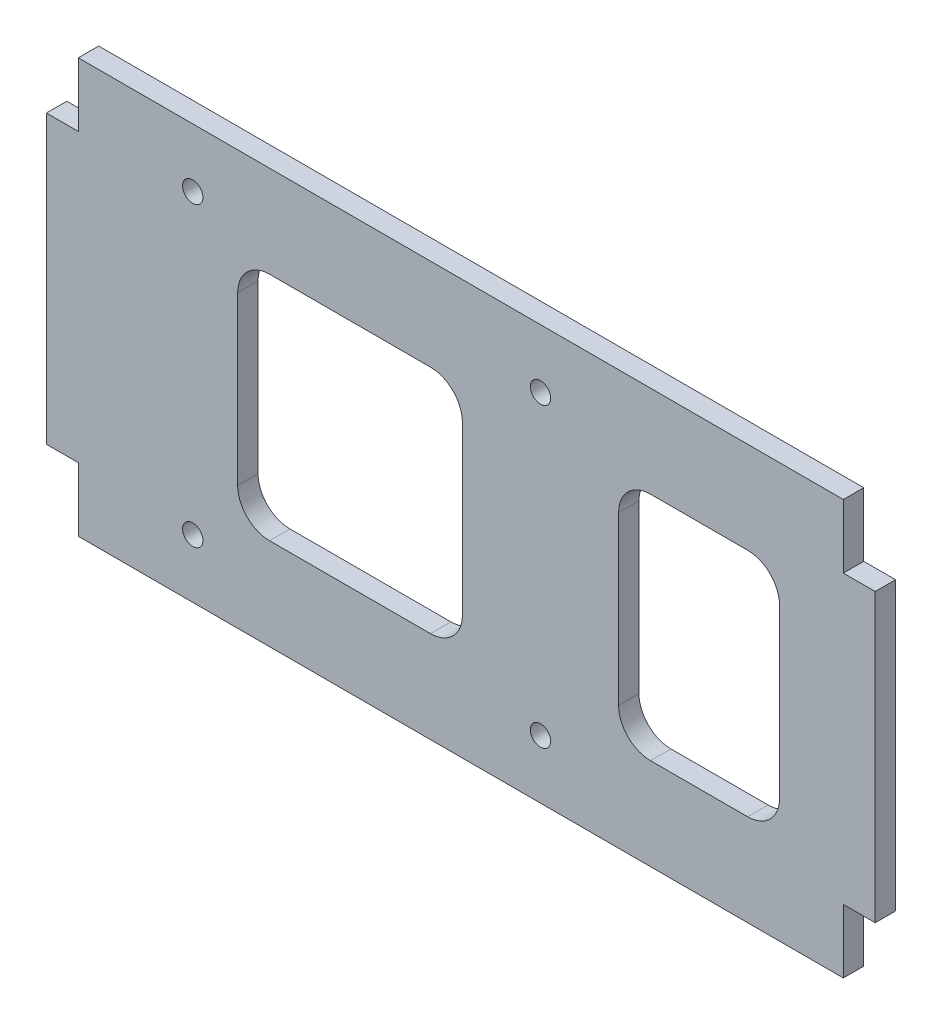
ISO-10303-21;
HEADER;
FILE_DESCRIPTION(('STEP AP214'),'2;1');
FILE_NAME('part.step','',(''),(''),'','','');
FILE_SCHEMA(('AUTOMOTIVE_DESIGN { 1 0 10303 214 1 1 1 1 }'));
ENDSEC;
DATA;
#1=APPLICATION_CONTEXT('core data for automotive mechanical design processes');
#2=APPLICATION_PROTOCOL_DEFINITION('international standard','automotive_design',2000,#1);
#3=PRODUCT_CONTEXT('',#1,'mechanical');
#4=PRODUCT('Part','Part','',(#3));
#5=PRODUCT_RELATED_PRODUCT_CATEGORY('part','',(#4));
#6=PRODUCT_DEFINITION_FORMATION('','',#4);
#7=PRODUCT_DEFINITION_CONTEXT('part definition',#1,'design');
#8=PRODUCT_DEFINITION('design','',#6,#7);
#9=PRODUCT_DEFINITION_SHAPE('','',#8);
#10=(LENGTH_UNIT() NAMED_UNIT(*) SI_UNIT(.MILLI.,.METRE.));
#11=(NAMED_UNIT(*) PLANE_ANGLE_UNIT() SI_UNIT($,.RADIAN.));
#12=(NAMED_UNIT(*) SI_UNIT($,.STERADIAN.) SOLID_ANGLE_UNIT());
#13=UNCERTAINTY_MEASURE_WITH_UNIT(LENGTH_MEASURE(1.E-05),#10,'distance_accuracy_value','');
#14=(GEOMETRIC_REPRESENTATION_CONTEXT(3) GLOBAL_UNCERTAINTY_ASSIGNED_CONTEXT((#13)) GLOBAL_UNIT_ASSIGNED_CONTEXT((#10,
#11,#12)) REPRESENTATION_CONTEXT('',''));
#15=CARTESIAN_POINT('',(0.,0.,0.));
#16=DIRECTION('',(0.,0.,1.));
#17=DIRECTION('',(1.,0.,0.));
#18=AXIS2_PLACEMENT_3D('',#15,#16,#17);
#19=CARTESIAN_POINT('',(0.,0.,4.064));
#20=DIRECTION('',(0.,0.,-1.));
#21=DIRECTION('',(-1.,0.,0.));
#22=AXIS2_PLACEMENT_3D('',#19,#20,#21);
#23=PLANE('',#22);
#24=CARTESIAN_POINT('',(-53.7097973205949,-29.5910000000044,4.064));
#25=DIRECTION('',(0.,0.,1.));
#26=DIRECTION('',(1.,0.,0.));
#27=AXIS2_PLACEMENT_3D('',#24,#25,#26);
#28=CIRCLE('',#27,2.03199999999981);
#29=CARTESIAN_POINT('',(-51.6777973205951,-29.5910000000044,4.064));
#30=VERTEX_POINT('',#29);
#31=EDGE_CURVE('E812',#30,#30,#28,.T.);
#32=ORIENTED_EDGE('',*,*,#31,.F.);
#33=EDGE_LOOP('',(#32));
#34=FACE_BOUND('',#33,.T.);
#35=CARTESIAN_POINT('',(-53.7097973205949,29.5910000000039,4.064));
#36=DIRECTION('',(0.,0.,1.));
#37=DIRECTION('',(1.,0.,0.));
#38=AXIS2_PLACEMENT_3D('',#35,#36,#37);
#39=CIRCLE('',#38,2.03199999999981);
#40=CARTESIAN_POINT('',(-51.6777973205951,29.5910000000039,4.064));
#41=VERTEX_POINT('',#40);
#42=EDGE_CURVE('E258',#41,#41,#39,.T.);
#43=ORIENTED_EDGE('',*,*,#42,.F.);
#44=EDGE_LOOP('',(#43));
#45=FACE_BOUND('',#44,.T.);
#46=CARTESIAN_POINT('',(56.8325000000005,16.6370000000051,4.064));
#47=DIRECTION('',(0.,0.,1.));
#48=DIRECTION('',(1.,0.,0.));
#49=AXIS2_PLACEMENT_3D('',#46,#47,#48);
#50=CIRCLE('',#49,6.34999999999963);
#51=CARTESIAN_POINT('',(63.1825000000004,16.6370000000033,4.064));
#52=VERTEX_POINT('',#51);
#53=CARTESIAN_POINT('',(56.8325000000005,22.9870000000045,4.064));
#54=VERTEX_POINT('',#53);
#55=EDGE_CURVE('E288',#52,#54,#50,.T.);
#56=ORIENTED_EDGE('',*,*,#55,.F.);
#57=DIRECTION('',(0.,1.,0.));
#58=VECTOR('',#57,1.);
#59=CARTESIAN_POINT('',(63.1825000000004,16.6370000000033,4.064));
#60=LINE('',#59,#58);
#61=CARTESIAN_POINT('',(63.1825000000004,-16.6370000000056,4.064));
#62=VERTEX_POINT('',#61);
#63=EDGE_CURVE('E304',#62,#52,#60,.T.);
#64=ORIENTED_EDGE('',*,*,#63,.F.);
#65=CARTESIAN_POINT('',(56.8325000000005,-16.6370000000051,4.064));
#66=DIRECTION('',(0.,0.,1.));
#67=DIRECTION('',(1.,0.,0.));
#68=AXIS2_PLACEMENT_3D('',#65,#66,#67);
#69=CIRCLE('',#68,6.34999999999963);
#70=CARTESIAN_POINT('',(56.8325000000005,-22.9870000000045,4.064));
#71=VERTEX_POINT('',#70);
#72=EDGE_CURVE('E301',#71,#62,#69,.T.);
#73=ORIENTED_EDGE('',*,*,#72,.F.);
#74=DIRECTION('',(1.,0.,0.));
#75=VECTOR('',#74,1.);
#76=CARTESIAN_POINT('',(56.8325000000005,-22.9870000000045,4.064));
#77=LINE('',#76,#75);
#78=CARTESIAN_POINT('',(37.4649999999992,-22.987000000005,4.064));
#79=VERTEX_POINT('',#78);
#80=EDGE_CURVE('E299',#79,#71,#77,.T.);
#81=ORIENTED_EDGE('',*,*,#80,.F.);
#82=CARTESIAN_POINT('',(37.4649999999992,-16.6370000000042,4.064));
#83=DIRECTION('',(0.,0.,1.));
#84=DIRECTION('',(1.,0.,0.));
#85=AXIS2_PLACEMENT_3D('',#82,#83,#84);
#86=CIRCLE('',#85,6.35000000000074);
#87=CARTESIAN_POINT('',(31.114999999998,-16.6370000000042,4.064));
#88=VERTEX_POINT('',#87);
#89=EDGE_CURVE('E297',#88,#79,#86,.T.);
#90=ORIENTED_EDGE('',*,*,#89,.F.);
#91=DIRECTION('',(0.,-1.,0.));
#92=VECTOR('',#91,1.);
#93=CARTESIAN_POINT('',(31.114999999998,16.6370000000042,4.064));
#94=LINE('',#93,#92);
#95=CARTESIAN_POINT('',(31.1149999999984,16.6370000000042,4.064));
#96=VERTEX_POINT('',#95);
#97=EDGE_CURVE('E295',#96,#88,#94,.T.);
#98=ORIENTED_EDGE('',*,*,#97,.F.);
#99=CARTESIAN_POINT('',(37.4649999999992,16.6370000000042,4.064));
#100=DIRECTION('',(0.,0.,1.));
#101=DIRECTION('',(1.,0.,0.));
#102=AXIS2_PLACEMENT_3D('',#99,#100,#101);
#103=CIRCLE('',#102,6.35000000000074);
#104=CARTESIAN_POINT('',(37.4649999999992,22.9870000000045,4.064));
#105=VERTEX_POINT('',#104);
#106=EDGE_CURVE('E293',#105,#96,#103,.T.);
#107=ORIENTED_EDGE('',*,*,#106,.F.);
#108=DIRECTION('',(-1.,0.,0.));
#109=VECTOR('',#108,1.);
#110=CARTESIAN_POINT('',(56.8325000000005,22.9870000000045,4.064));
#111=LINE('',#110,#109);
#112=EDGE_CURVE('E290',#54,#105,#111,.T.);
#113=ORIENTED_EDGE('',*,*,#112,.F.);
#114=EDGE_LOOP('',(#56,#64,#73,#81,#90,#98,#107,#113));
#115=FACE_BOUND('',#114,.T.);
#116=DIRECTION('',(0.,1.,0.));
#117=VECTOR('',#116,1.);
#118=CARTESIAN_POINT('',(75.8825000000005,-28.5750000000022,4.064));
#119=LINE('',#118,#117);
#120=CARTESIAN_POINT('',(75.8825000000005,-41.274999999998,4.064));
#121=VERTEX_POINT('',#120);
#122=CARTESIAN_POINT('',(75.8825000000005,-28.5750000000022,4.064));
#123=VERTEX_POINT('',#122);
#124=EDGE_CURVE('E347',#121,#123,#119,.T.);
#125=ORIENTED_EDGE('',*,*,#124,.T.);
#126=DIRECTION('',(1.,0.,0.));
#127=VECTOR('',#126,1.);
#128=CARTESIAN_POINT('',(82.2324999999999,-28.5750000000022,4.064));
#129=LINE('',#128,#127);
#130=CARTESIAN_POINT('',(82.2324999999999,-28.5750000000022,4.064));
#131=VERTEX_POINT('',#130);
#132=EDGE_CURVE('E350',#123,#131,#129,.T.);
#133=ORIENTED_EDGE('',*,*,#132,.T.);
#134=DIRECTION('',(0.,1.,0.));
#135=VECTOR('',#134,1.);
#136=CARTESIAN_POINT('',(82.2324999999999,28.5749999999991,4.064));
#137=LINE('',#136,#135);
#138=CARTESIAN_POINT('',(82.2324999999999,28.5749999999991,4.064));
#139=VERTEX_POINT('',#138);
#140=EDGE_CURVE('E353',#131,#139,#137,.T.);
#141=ORIENTED_EDGE('',*,*,#140,.T.);
#142=DIRECTION('',(-1.,0.,0.));
#143=VECTOR('',#142,1.);
#144=CARTESIAN_POINT('',(82.2324999999999,28.5749999999991,4.064));
#145=LINE('',#144,#143);
#146=CARTESIAN_POINT('',(75.8825000000005,28.5749999999991,4.064));
#147=VERTEX_POINT('',#146);
#148=EDGE_CURVE('E355',#139,#147,#145,.T.);
#149=ORIENTED_EDGE('',*,*,#148,.T.);
#150=DIRECTION('',(0.,1.,0.));
#151=VECTOR('',#150,1.);
#152=CARTESIAN_POINT('',(75.8825000000005,41.2750000000051,4.064));
#153=LINE('',#152,#151);
#154=CARTESIAN_POINT('',(75.8825000000005,41.2750000000051,4.064));
#155=VERTEX_POINT('',#154);
#156=EDGE_CURVE('E357',#147,#155,#153,.T.);
#157=ORIENTED_EDGE('',*,*,#156,.T.);
#158=DIRECTION('',(-1.,0.,0.));
#159=VECTOR('',#158,1.);
#160=CARTESIAN_POINT('',(75.8825000000005,41.2750000000051,4.064));
#161=LINE('',#160,#159);
#162=CARTESIAN_POINT('',(-76.5174999999996,41.2750000000037,4.064));
#163=VERTEX_POINT('',#162);
#164=EDGE_CURVE('E359',#155,#163,#161,.T.);
#165=ORIENTED_EDGE('',*,*,#164,.T.);
#166=DIRECTION('',(0.,-1.,0.));
#167=VECTOR('',#166,1.);
#168=CARTESIAN_POINT('',(-76.5174999999996,41.2750000000037,4.064));
#169=LINE('',#168,#167);
#170=CARTESIAN_POINT('',(-76.5174999999996,28.5749999999991,4.064));
#171=VERTEX_POINT('',#170);
#172=EDGE_CURVE('E361',#163,#171,#169,.T.);
#173=ORIENTED_EDGE('',*,*,#172,.T.);
#174=DIRECTION('',(-1.,0.,0.));
#175=VECTOR('',#174,1.);
#176=CARTESIAN_POINT('',(-82.8675000000008,28.5749999999991,4.064));
#177=LINE('',#176,#175);
#178=CARTESIAN_POINT('',(-82.8675000000008,28.5749999999991,4.064));
#179=VERTEX_POINT('',#178);
#180=EDGE_CURVE('E363',#171,#179,#177,.T.);
#181=ORIENTED_EDGE('',*,*,#180,.T.);
#182=DIRECTION('',(0.,-1.,0.));
#183=VECTOR('',#182,1.);
#184=CARTESIAN_POINT('',(-82.8675000000008,28.5749999999991,4.064));
#185=LINE('',#184,#183);
#186=CARTESIAN_POINT('',(-82.8675000000008,-28.5749999999991,4.064));
#187=VERTEX_POINT('',#186);
#188=EDGE_CURVE('E365',#179,#187,#185,.T.);
#189=ORIENTED_EDGE('',*,*,#188,.T.);
#190=DIRECTION('',(1.,0.,0.));
#191=VECTOR('',#190,1.);
#192=CARTESIAN_POINT('',(-82.8675000000008,-28.5749999999991,4.064));
#193=LINE('',#192,#191);
#194=CARTESIAN_POINT('',(-76.5174999999996,-28.5749999999991,4.064));
#195=VERTEX_POINT('',#194);
#196=EDGE_CURVE('E367',#187,#195,#193,.T.);
#197=ORIENTED_EDGE('',*,*,#196,.T.);
#198=DIRECTION('',(0.,-1.,0.));
#199=VECTOR('',#198,1.);
#200=CARTESIAN_POINT('',(-76.5174999999996,-28.5749999999991,4.064));
#201=LINE('',#200,#199);
#202=CARTESIAN_POINT('',(-76.5174999999996,-41.274999999998,4.064));
#203=VERTEX_POINT('',#202);
#204=EDGE_CURVE('E369',#195,#203,#201,.T.);
#205=ORIENTED_EDGE('',*,*,#204,.T.);
#206=DIRECTION('',(1.,0.,0.));
#207=VECTOR('',#206,1.);
#208=CARTESIAN_POINT('',(75.8825000000005,-41.274999999998,4.064));
#209=LINE('',#208,#207);
#210=EDGE_CURVE('E371',#203,#121,#209,.T.);
#211=ORIENTED_EDGE('',*,*,#210,.T.);
#212=EDGE_LOOP('',(#125,#133,#141,#149,#157,#165,#173,#181,#189,#197,#205,#211));
#213=FACE_BOUND('',#212,.T.);
#214=CARTESIAN_POINT('',(-6.34999999999941,16.6370000000051,4.064));
#215=DIRECTION('',(0.,0.,1.));
#216=DIRECTION('',(1.,0.,0.));
#217=AXIS2_PLACEMENT_3D('',#214,#215,#216);
#218=CIRCLE('',#217,6.34999999999963);
#219=CARTESIAN_POINT('',(4.44089209850063E-13,16.6370000000033,4.064));
#220=VERTEX_POINT('',#219);
#221=CARTESIAN_POINT('',(-6.34999999999941,22.9870000000045,4.064));
#222=VERTEX_POINT('',#221);
#223=EDGE_CURVE('E220',#220,#222,#218,.T.);
#224=ORIENTED_EDGE('',*,*,#223,.F.);
#225=DIRECTION('',(0.,1.,0.));
#226=VECTOR('',#225,1.);
#227=CARTESIAN_POINT('',(4.44089209850063E-13,-16.6370000000056,4.064));
#228=LINE('',#227,#226);
#229=CARTESIAN_POINT('',(4.44089209850063E-13,-16.6370000000056,4.064));
#230=VERTEX_POINT('',#229);
#231=EDGE_CURVE('E255',#230,#220,#228,.T.);
#232=ORIENTED_EDGE('',*,*,#231,.F.);
#233=CARTESIAN_POINT('',(-6.34999999999941,-16.6370000000051,4.064));
#234=DIRECTION('',(0.,0.,1.));
#235=DIRECTION('',(1.,0.,0.));
#236=AXIS2_PLACEMENT_3D('',#233,#234,#235);
#237=CIRCLE('',#236,6.34999999999963);
#238=CARTESIAN_POINT('',(-6.34999999999941,-22.9870000000045,4.064));
#239=VERTEX_POINT('',#238);
#240=EDGE_CURVE('E253',#239,#230,#237,.T.);
#241=ORIENTED_EDGE('',*,*,#240,.F.);
#242=DIRECTION('',(1.,0.,0.));
#243=VECTOR('',#242,1.);
#244=CARTESIAN_POINT('',(-6.34999999999941,-22.9870000000045,4.064));
#245=LINE('',#244,#243);
#246=CARTESIAN_POINT('',(-38.4174999999995,-22.987000000005,4.064));
#247=VERTEX_POINT('',#246);
#248=EDGE_CURVE('E251',#247,#239,#245,.T.);
#249=ORIENTED_EDGE('',*,*,#248,.F.);
#250=CARTESIAN_POINT('',(-38.4174999999995,-16.6370000000042,4.064));
#251=DIRECTION('',(0.,0.,1.));
#252=DIRECTION('',(1.,0.,0.));
#253=AXIS2_PLACEMENT_3D('',#250,#251,#252);
#254=CIRCLE('',#253,6.35000000000074);
#255=CARTESIAN_POINT('',(-44.7675000000007,-16.6370000000042,4.064));
#256=VERTEX_POINT('',#255);
#257=EDGE_CURVE('E249',#256,#247,#254,.T.);
#258=ORIENTED_EDGE('',*,*,#257,.F.);
#259=DIRECTION('',(0.,-1.,0.));
#260=VECTOR('',#259,1.);
#261=CARTESIAN_POINT('',(-44.7675000000007,16.6370000000042,4.064));
#262=LINE('',#261,#260);
#263=CARTESIAN_POINT('',(-44.7675000000003,16.6370000000042,4.064));
#264=VERTEX_POINT('',#263);
#265=EDGE_CURVE('E244',#264,#256,#262,.T.);
#266=ORIENTED_EDGE('',*,*,#265,.F.);
#267=CARTESIAN_POINT('',(-38.4174999999995,16.6370000000042,4.064));
#268=DIRECTION('',(0.,0.,1.));
#269=DIRECTION('',(1.,0.,0.));
#270=AXIS2_PLACEMENT_3D('',#267,#268,#269);
#271=CIRCLE('',#270,6.35000000000074);
#272=CARTESIAN_POINT('',(-38.4174999999995,22.9870000000045,4.064));
#273=VERTEX_POINT('',#272);
#274=EDGE_CURVE('E242',#273,#264,#271,.T.);
#275=ORIENTED_EDGE('',*,*,#274,.F.);
#276=DIRECTION('',(-1.,0.,0.));
#277=VECTOR('',#276,1.);
#278=CARTESIAN_POINT('',(-6.34999999999941,22.9870000000045,4.064));
#279=LINE('',#278,#277);
#280=EDGE_CURVE('E228',#222,#273,#279,.T.);
#281=ORIENTED_EDGE('',*,*,#280,.F.);
#282=EDGE_LOOP('',(#224,#232,#241,#249,#258,#266,#275,#281));
#283=FACE_BOUND('',#282,.T.);
#284=CARTESIAN_POINT('',(15.5574999999999,29.5910000000039,4.064));
#285=DIRECTION('',(0.,0.,1.));
#286=DIRECTION('',(1.,0.,0.));
#287=AXIS2_PLACEMENT_3D('',#284,#285,#286);
#288=CIRCLE('',#287,2.03199999999981);
#289=CARTESIAN_POINT('',(17.5894999999997,29.5910000000039,4.064));
#290=VERTEX_POINT('',#289);
#291=EDGE_CURVE('E818',#290,#290,#288,.T.);
#292=ORIENTED_EDGE('',*,*,#291,.F.);
#293=EDGE_LOOP('',(#292));
#294=FACE_BOUND('',#293,.T.);
#295=CARTESIAN_POINT('',(15.5574999999999,-29.5910000000044,4.064));
#296=DIRECTION('',(0.,0.,1.));
#297=DIRECTION('',(1.,0.,0.));
#298=AXIS2_PLACEMENT_3D('',#295,#296,#297);
#299=CIRCLE('',#298,2.03199999999981);
#300=CARTESIAN_POINT('',(17.5894999999997,-29.5910000000044,4.064));
#301=VERTEX_POINT('',#300);
#302=EDGE_CURVE('E803',#301,#301,#299,.T.);
#303=ORIENTED_EDGE('',*,*,#302,.F.);
#304=EDGE_LOOP('',(#303));
#305=FACE_BOUND('',#304,.T.);
#306=ADVANCED_FACE('F35',(#34,#45,#115,#213,#283,#294,#305),#23,.F.);
#307=CARTESIAN_POINT('',(0.,0.,0.));
#308=DIRECTION('',(0.,0.,-1.));
#309=DIRECTION('',(-1.,0.,0.));
#310=AXIS2_PLACEMENT_3D('',#307,#308,#309);
#311=PLANE('',#310);
#312=CARTESIAN_POINT('',(-53.7097973205949,-29.5910000000044,0.));
#313=DIRECTION('',(0.,0.,1.));
#314=DIRECTION('',(1.,0.,0.));
#315=AXIS2_PLACEMENT_3D('',#312,#313,#314);
#316=CIRCLE('',#315,2.03199999999981);
#317=CARTESIAN_POINT('',(-51.6777973205951,-29.5910000000044,0.));
#318=VERTEX_POINT('',#317);
#319=EDGE_CURVE('E809',#318,#318,#316,.T.);
#320=ORIENTED_EDGE('',*,*,#319,.T.);
#321=EDGE_LOOP('',(#320));
#322=FACE_BOUND('',#321,.T.);
#323=CARTESIAN_POINT('',(-53.7097973205949,29.5910000000039,0.));
#324=DIRECTION('',(0.,0.,1.));
#325=DIRECTION('',(1.,0.,0.));
#326=AXIS2_PLACEMENT_3D('',#323,#324,#325);
#327=CIRCLE('',#326,2.03199999999981);
#328=CARTESIAN_POINT('',(-51.6777973205951,29.5910000000039,0.));
#329=VERTEX_POINT('',#328);
#330=EDGE_CURVE('E821',#329,#329,#327,.T.);
#331=ORIENTED_EDGE('',*,*,#330,.T.);
#332=EDGE_LOOP('',(#331));
#333=FACE_BOUND('',#332,.T.);
#334=DIRECTION('',(0.,1.,0.));
#335=VECTOR('',#334,1.);
#336=CARTESIAN_POINT('',(63.1825000000004,16.6370000000033,0.));
#337=LINE('',#336,#335);
#338=CARTESIAN_POINT('',(63.1825000000001,-16.6370000000056,0.));
#339=VERTEX_POINT('',#338);
#340=CARTESIAN_POINT('',(63.1825000000004,16.6370000000033,0.));
#341=VERTEX_POINT('',#340);
#342=EDGE_CURVE('E291',#339,#341,#337,.T.);
#343=ORIENTED_EDGE('',*,*,#342,.T.);
#344=CARTESIAN_POINT('',(56.8325000000005,16.6370000000051,0.));
#345=DIRECTION('',(0.,0.,1.));
#346=DIRECTION('',(1.,0.,0.));
#347=AXIS2_PLACEMENT_3D('',#344,#345,#346);
#348=CIRCLE('',#347,6.34999999999963);
#349=CARTESIAN_POINT('',(56.8325000000005,22.9870000000045,0.));
#350=VERTEX_POINT('',#349);
#351=EDGE_CURVE('E236',#341,#350,#348,.T.);
#352=ORIENTED_EDGE('',*,*,#351,.T.);
#353=DIRECTION('',(-1.,0.,0.));
#354=VECTOR('',#353,1.);
#355=CARTESIAN_POINT('',(56.8325000000005,22.9870000000045,0.));
#356=LINE('',#355,#354);
#357=CARTESIAN_POINT('',(37.4649999999992,22.9870000000045,0.));
#358=VERTEX_POINT('',#357);
#359=EDGE_CURVE('E309',#350,#358,#356,.T.);
#360=ORIENTED_EDGE('',*,*,#359,.T.);
#361=CARTESIAN_POINT('',(37.4649999999992,16.6370000000042,0.));
#362=DIRECTION('',(0.,0.,1.));
#363=DIRECTION('',(1.,0.,0.));
#364=AXIS2_PLACEMENT_3D('',#361,#362,#363);
#365=CIRCLE('',#364,6.35000000000074);
#366=CARTESIAN_POINT('',(31.1149999999984,16.6370000000042,0.));
#367=VERTEX_POINT('',#366);
#368=EDGE_CURVE('E312',#358,#367,#365,.T.);
#369=ORIENTED_EDGE('',*,*,#368,.T.);
#370=DIRECTION('',(0.,-1.,0.));
#371=VECTOR('',#370,1.);
#372=CARTESIAN_POINT('',(31.114999999998,16.6370000000042,0.));
#373=LINE('',#372,#371);
#374=CARTESIAN_POINT('',(31.114999999998,-16.6370000000042,0.));
#375=VERTEX_POINT('',#374);
#376=EDGE_CURVE('E315',#367,#375,#373,.T.);
#377=ORIENTED_EDGE('',*,*,#376,.T.);
#378=CARTESIAN_POINT('',(37.4649999999992,-16.6370000000042,0.));
#379=DIRECTION('',(0.,0.,1.));
#380=DIRECTION('',(1.,0.,0.));
#381=AXIS2_PLACEMENT_3D('',#378,#379,#380);
#382=CIRCLE('',#381,6.35000000000074);
#383=CARTESIAN_POINT('',(37.4649999999992,-22.987000000005,0.));
#384=VERTEX_POINT('',#383);
#385=EDGE_CURVE('E318',#375,#384,#382,.T.);
#386=ORIENTED_EDGE('',*,*,#385,.T.);
#387=DIRECTION('',(1.,0.,0.));
#388=VECTOR('',#387,1.);
#389=CARTESIAN_POINT('',(56.8325000000005,-22.9870000000045,0.));
#390=LINE('',#389,#388);
#391=CARTESIAN_POINT('',(56.8325000000005,-22.9870000000045,0.));
#392=VERTEX_POINT('',#391);
#393=EDGE_CURVE('E321',#384,#392,#390,.T.);
#394=ORIENTED_EDGE('',*,*,#393,.T.);
#395=CARTESIAN_POINT('',(56.8325000000005,-16.6370000000051,0.));
#396=DIRECTION('',(0.,0.,1.));
#397=DIRECTION('',(1.,0.,0.));
#398=AXIS2_PLACEMENT_3D('',#395,#396,#397);
#399=CIRCLE('',#398,6.34999999999963);
#400=EDGE_CURVE('E324',#392,#339,#399,.T.);
#401=ORIENTED_EDGE('',*,*,#400,.T.);
#402=EDGE_LOOP('',(#343,#352,#360,#369,#377,#386,#394,#401));
#403=FACE_BOUND('',#402,.T.);
#404=DIRECTION('',(0.,1.,0.));
#405=VECTOR('',#404,1.);
#406=CARTESIAN_POINT('',(75.8825000000005,-28.5750000000022,0.));
#407=LINE('',#406,#405);
#408=CARTESIAN_POINT('',(75.8825000000005,-41.274999999998,0.));
#409=VERTEX_POINT('',#408);
#410=CARTESIAN_POINT('',(75.8825000000005,-28.5750000000022,0.));
#411=VERTEX_POINT('',#410);
#412=EDGE_CURVE('E346',#409,#411,#407,.T.);
#413=ORIENTED_EDGE('',*,*,#412,.F.);
#414=DIRECTION('',(1.,0.,0.));
#415=VECTOR('',#414,1.);
#416=CARTESIAN_POINT('',(75.8825000000005,-41.274999999998,0.));
#417=LINE('',#416,#415);
#418=CARTESIAN_POINT('',(-76.5174999999996,-41.274999999998,0.));
#419=VERTEX_POINT('',#418);
#420=EDGE_CURVE('E351',#419,#409,#417,.T.);
#421=ORIENTED_EDGE('',*,*,#420,.F.);
#422=DIRECTION('',(0.,-1.,0.));
#423=VECTOR('',#422,1.);
#424=CARTESIAN_POINT('',(-76.5174999999996,-28.5749999999991,0.));
#425=LINE('',#424,#423);
#426=CARTESIAN_POINT('',(-76.5174999999996,-28.5749999999991,0.));
#427=VERTEX_POINT('',#426);
#428=EDGE_CURVE('E394',#427,#419,#425,.T.);
#429=ORIENTED_EDGE('',*,*,#428,.F.);
#430=DIRECTION('',(1.,0.,0.));
#431=VECTOR('',#430,1.);
#432=CARTESIAN_POINT('',(-82.8675000000008,-28.5749999999991,0.));
#433=LINE('',#432,#431);
#434=CARTESIAN_POINT('',(-82.8675000000008,-28.5749999999991,0.));
#435=VERTEX_POINT('',#434);
#436=EDGE_CURVE('E392',#435,#427,#433,.T.);
#437=ORIENTED_EDGE('',*,*,#436,.F.);
#438=DIRECTION('',(0.,-1.,0.));
#439=VECTOR('',#438,1.);
#440=CARTESIAN_POINT('',(-82.8675000000008,28.5749999999991,0.));
#441=LINE('',#440,#439);
#442=CARTESIAN_POINT('',(-82.8675000000008,28.5749999999991,0.));
#443=VERTEX_POINT('',#442);
#444=EDGE_CURVE('E390',#443,#435,#441,.T.);
#445=ORIENTED_EDGE('',*,*,#444,.F.);
#446=DIRECTION('',(-1.,0.,0.));
#447=VECTOR('',#446,1.);
#448=CARTESIAN_POINT('',(-82.8675000000008,28.5749999999991,0.));
#449=LINE('',#448,#447);
#450=CARTESIAN_POINT('',(-76.5174999999996,28.5749999999991,0.));
#451=VERTEX_POINT('',#450);
#452=EDGE_CURVE('E388',#451,#443,#449,.T.);
#453=ORIENTED_EDGE('',*,*,#452,.F.);
#454=DIRECTION('',(0.,-1.,0.));
#455=VECTOR('',#454,1.);
#456=CARTESIAN_POINT('',(-76.5174999999996,41.2750000000037,0.));
#457=LINE('',#456,#455);
#458=CARTESIAN_POINT('',(-76.5174999999996,41.2750000000037,0.));
#459=VERTEX_POINT('',#458);
#460=EDGE_CURVE('E386',#459,#451,#457,.T.);
#461=ORIENTED_EDGE('',*,*,#460,.F.);
#462=DIRECTION('',(-1.,0.,0.));
#463=VECTOR('',#462,1.);
#464=CARTESIAN_POINT('',(75.8825000000005,41.2750000000051,0.));
#465=LINE('',#464,#463);
#466=CARTESIAN_POINT('',(75.8825000000005,41.2750000000051,0.));
#467=VERTEX_POINT('',#466);
#468=EDGE_CURVE('E384',#467,#459,#465,.T.);
#469=ORIENTED_EDGE('',*,*,#468,.F.);
#470=DIRECTION('',(0.,1.,0.));
#471=VECTOR('',#470,1.);
#472=CARTESIAN_POINT('',(75.8825000000005,41.2750000000051,0.));
#473=LINE('',#472,#471);
#474=CARTESIAN_POINT('',(75.8825000000005,28.5749999999991,0.));
#475=VERTEX_POINT('',#474);
#476=EDGE_CURVE('E382',#475,#467,#473,.T.);
#477=ORIENTED_EDGE('',*,*,#476,.F.);
#478=DIRECTION('',(-1.,0.,0.));
#479=VECTOR('',#478,1.);
#480=CARTESIAN_POINT('',(82.2324999999999,28.5749999999991,0.));
#481=LINE('',#480,#479);
#482=CARTESIAN_POINT('',(82.2324999999999,28.5749999999991,0.));
#483=VERTEX_POINT('',#482);
#484=EDGE_CURVE('E380',#483,#475,#481,.T.);
#485=ORIENTED_EDGE('',*,*,#484,.F.);
#486=DIRECTION('',(0.,1.,0.));
#487=VECTOR('',#486,1.);
#488=CARTESIAN_POINT('',(82.2324999999999,28.5749999999991,0.));
#489=LINE('',#488,#487);
#490=CARTESIAN_POINT('',(82.2324999999999,-28.5750000000022,0.));
#491=VERTEX_POINT('',#490);
#492=EDGE_CURVE('E378',#491,#483,#489,.T.);
#493=ORIENTED_EDGE('',*,*,#492,.F.);
#494=DIRECTION('',(1.,0.,0.));
#495=VECTOR('',#494,1.);
#496=CARTESIAN_POINT('',(82.2324999999999,-28.5750000000022,0.));
#497=LINE('',#496,#495);
#498=EDGE_CURVE('E376',#411,#491,#497,.T.);
#499=ORIENTED_EDGE('',*,*,#498,.F.);
#500=EDGE_LOOP('',(#413,#421,#429,#437,#445,#453,#461,#469,#477,#485,#493,#499));
#501=FACE_BOUND('',#500,.T.);
#502=DIRECTION('',(0.,1.,0.));
#503=VECTOR('',#502,1.);
#504=CARTESIAN_POINT('',(4.44089209850063E-13,-16.6370000000056,0.));
#505=LINE('',#504,#503);
#506=CARTESIAN_POINT('',(2.22044604925031E-13,-16.6370000000056,0.));
#507=VERTEX_POINT('',#506);
#508=CARTESIAN_POINT('',(4.44089209850063E-13,16.6370000000033,0.));
#509=VERTEX_POINT('',#508);
#510=EDGE_CURVE('E229',#507,#509,#505,.T.);
#511=ORIENTED_EDGE('',*,*,#510,.T.);
#512=CARTESIAN_POINT('',(-6.34999999999941,16.6370000000051,0.));
#513=DIRECTION('',(0.,0.,1.));
#514=DIRECTION('',(1.,0.,0.));
#515=AXIS2_PLACEMENT_3D('',#512,#513,#514);
#516=CIRCLE('',#515,6.34999999999963);
#517=CARTESIAN_POINT('',(-6.34999999999941,22.9870000000045,0.));
#518=VERTEX_POINT('',#517);
#519=EDGE_CURVE('E58',#509,#518,#516,.T.);
#520=ORIENTED_EDGE('',*,*,#519,.T.);
#521=DIRECTION('',(-1.,0.,0.));
#522=VECTOR('',#521,1.);
#523=CARTESIAN_POINT('',(-6.34999999999941,22.9870000000045,0.));
#524=LINE('',#523,#522);
#525=CARTESIAN_POINT('',(-38.4174999999995,22.9870000000045,0.));
#526=VERTEX_POINT('',#525);
#527=EDGE_CURVE('E235',#518,#526,#524,.T.);
#528=ORIENTED_EDGE('',*,*,#527,.T.);
#529=CARTESIAN_POINT('',(-38.4174999999995,16.6370000000042,0.));
#530=DIRECTION('',(0.,0.,1.));
#531=DIRECTION('',(1.,0.,0.));
#532=AXIS2_PLACEMENT_3D('',#529,#530,#531);
#533=CIRCLE('',#532,6.35000000000074);
#534=CARTESIAN_POINT('',(-44.7675000000003,16.6370000000042,0.));
#535=VERTEX_POINT('',#534);
#536=EDGE_CURVE('E260',#526,#535,#533,.T.);
#537=ORIENTED_EDGE('',*,*,#536,.T.);
#538=DIRECTION('',(0.,-1.,0.));
#539=VECTOR('',#538,1.);
#540=CARTESIAN_POINT('',(-44.7675000000007,16.6370000000042,0.));
#541=LINE('',#540,#539);
#542=CARTESIAN_POINT('',(-44.7675000000007,-16.6370000000042,0.));
#543=VERTEX_POINT('',#542);
#544=EDGE_CURVE('E263',#535,#543,#541,.T.);
#545=ORIENTED_EDGE('',*,*,#544,.T.);
#546=CARTESIAN_POINT('',(-38.4174999999995,-16.6370000000042,0.));
#547=DIRECTION('',(0.,0.,1.));
#548=DIRECTION('',(1.,0.,0.));
#549=AXIS2_PLACEMENT_3D('',#546,#547,#548);
#550=CIRCLE('',#549,6.35000000000074);
#551=CARTESIAN_POINT('',(-38.4174999999995,-22.987000000005,0.));
#552=VERTEX_POINT('',#551);
#553=EDGE_CURVE('E266',#543,#552,#550,.T.);
#554=ORIENTED_EDGE('',*,*,#553,.T.);
#555=DIRECTION('',(1.,0.,0.));
#556=VECTOR('',#555,1.);
#557=CARTESIAN_POINT('',(-6.34999999999941,-22.9870000000045,0.));
#558=LINE('',#557,#556);
#559=CARTESIAN_POINT('',(-6.34999999999941,-22.9870000000045,0.));
#560=VERTEX_POINT('',#559);
#561=EDGE_CURVE('E269',#552,#560,#558,.T.);
#562=ORIENTED_EDGE('',*,*,#561,.T.);
#563=CARTESIAN_POINT('',(-6.34999999999941,-16.6370000000051,0.));
#564=DIRECTION('',(0.,0.,1.));
#565=DIRECTION('',(1.,0.,0.));
#566=AXIS2_PLACEMENT_3D('',#563,#564,#565);
#567=CIRCLE('',#566,6.34999999999963);
#568=EDGE_CURVE('E272',#560,#507,#567,.T.);
#569=ORIENTED_EDGE('',*,*,#568,.T.);
#570=EDGE_LOOP('',(#511,#520,#528,#537,#545,#554,#562,#569));
#571=FACE_BOUND('',#570,.T.);
#572=CARTESIAN_POINT('',(15.5574999999999,29.5910000000039,0.));
#573=DIRECTION('',(0.,0.,1.));
#574=DIRECTION('',(1.,0.,0.));
#575=AXIS2_PLACEMENT_3D('',#572,#573,#574);
#576=CIRCLE('',#575,2.03199999999981);
#577=CARTESIAN_POINT('',(17.5894999999997,29.5910000000039,0.));
#578=VERTEX_POINT('',#577);
#579=EDGE_CURVE('E815',#578,#578,#576,.T.);
#580=ORIENTED_EDGE('',*,*,#579,.T.);
#581=EDGE_LOOP('',(#580));
#582=FACE_BOUND('',#581,.T.);
#583=CARTESIAN_POINT('',(15.5574999999999,-29.5910000000044,0.));
#584=DIRECTION('',(0.,0.,1.));
#585=DIRECTION('',(1.,0.,0.));
#586=AXIS2_PLACEMENT_3D('',#583,#584,#585);
#587=CIRCLE('',#586,2.03199999999981);
#588=CARTESIAN_POINT('',(17.5894999999997,-29.5910000000044,0.));
#589=VERTEX_POINT('',#588);
#590=EDGE_CURVE('E806',#589,#589,#587,.T.);
#591=ORIENTED_EDGE('',*,*,#590,.T.);
#592=EDGE_LOOP('',(#591));
#593=FACE_BOUND('',#592,.T.);
#594=ADVANCED_FACE('F436',(#322,#333,#403,#501,#571,#582,#593),#311,.T.);
#595=CARTESIAN_POINT('',(75.8825000000005,-28.5750000000022,4.064));
#596=DIRECTION('',(-1.,0.,0.));
#597=DIRECTION('',(0.,0.,1.));
#598=AXIS2_PLACEMENT_3D('',#595,#596,#597);
#599=PLANE('',#598);
#600=ORIENTED_EDGE('',*,*,#412,.T.);
#601=DIRECTION('',(0.,0.,-1.));
#602=VECTOR('',#601,1.);
#603=CARTESIAN_POINT('',(75.8825000000005,-28.5750000000022,4.064));
#604=LINE('',#603,#602);
#605=EDGE_CURVE('E11',#123,#411,#604,.T.);
#606=ORIENTED_EDGE('',*,*,#605,.F.);
#607=ORIENTED_EDGE('',*,*,#124,.F.);
#608=DIRECTION('',(0.,0.,-1.));
#609=VECTOR('',#608,1.);
#610=CARTESIAN_POINT('',(75.8825000000005,-41.274999999998,4.064));
#611=LINE('',#610,#609);
#612=EDGE_CURVE('E373',#121,#409,#611,.T.);
#613=ORIENTED_EDGE('',*,*,#612,.T.);
#614=EDGE_LOOP('',(#600,#606,#607,#613));
#615=FACE_BOUND('',#614,.T.);
#616=ADVANCED_FACE('F37',(#615),#599,.F.);
#617=CARTESIAN_POINT('',(82.2324999999999,-28.5750000000022,4.064));
#618=DIRECTION('',(0.,1.,0.));
#619=DIRECTION('',(0.,0.,1.));
#620=AXIS2_PLACEMENT_3D('',#617,#618,#619);
#621=PLANE('',#620);
#622=ORIENTED_EDGE('',*,*,#498,.T.);
#623=DIRECTION('',(0.,0.,-1.));
#624=VECTOR('',#623,1.);
#625=CARTESIAN_POINT('',(82.2324999999999,-28.5750000000022,4.064));
#626=LINE('',#625,#624);
#627=EDGE_CURVE('E43',#131,#491,#626,.T.);
#628=ORIENTED_EDGE('',*,*,#627,.F.);
#629=ORIENTED_EDGE('',*,*,#132,.F.);
#630=ORIENTED_EDGE('',*,*,#605,.T.);
#631=EDGE_LOOP('',(#622,#628,#629,#630));
#632=FACE_BOUND('',#631,.T.);
#633=ADVANCED_FACE('F453',(#632),#621,.F.);
#634=CARTESIAN_POINT('',(82.2324999999999,28.5749999999991,4.064));
#635=DIRECTION('',(-1.,0.,0.));
#636=DIRECTION('',(0.,0.,1.));
#637=AXIS2_PLACEMENT_3D('',#634,#635,#636);
#638=PLANE('',#637);
#639=ORIENTED_EDGE('',*,*,#492,.T.);
#640=DIRECTION('',(0.,0.,-1.));
#641=VECTOR('',#640,1.);
#642=CARTESIAN_POINT('',(82.2324999999999,28.5749999999991,4.064));
#643=LINE('',#642,#641);
#644=EDGE_CURVE('E423',#139,#483,#643,.T.);
#645=ORIENTED_EDGE('',*,*,#644,.F.);
#646=ORIENTED_EDGE('',*,*,#140,.F.);
#647=ORIENTED_EDGE('',*,*,#627,.T.);
#648=EDGE_LOOP('',(#639,#645,#646,#647));
#649=FACE_BOUND('',#648,.T.);
#650=ADVANCED_FACE('F430',(#649),#638,.F.);
#651=CARTESIAN_POINT('',(82.2324999999999,28.5749999999991,4.064));
#652=DIRECTION('',(0.,-1.,0.));
#653=DIRECTION('',(0.,0.,-1.));
#654=AXIS2_PLACEMENT_3D('',#651,#652,#653);
#655=PLANE('',#654);
#656=ORIENTED_EDGE('',*,*,#484,.T.);
#657=DIRECTION('',(0.,0.,-1.));
#658=VECTOR('',#657,1.);
#659=CARTESIAN_POINT('',(75.8825000000005,28.5749999999991,4.064));
#660=LINE('',#659,#658);
#661=EDGE_CURVE('E420',#147,#475,#660,.T.);
#662=ORIENTED_EDGE('',*,*,#661,.F.);
#663=ORIENTED_EDGE('',*,*,#148,.F.);
#664=ORIENTED_EDGE('',*,*,#644,.T.);
#665=EDGE_LOOP('',(#656,#662,#663,#664));
#666=FACE_BOUND('',#665,.T.);
#667=ADVANCED_FACE('F442',(#666),#655,.F.);
#668=CARTESIAN_POINT('',(75.8825000000005,41.2750000000051,4.064));
#669=DIRECTION('',(-1.,0.,0.));
#670=DIRECTION('',(0.,0.,1.));
#671=AXIS2_PLACEMENT_3D('',#668,#669,#670);
#672=PLANE('',#671);
#673=ORIENTED_EDGE('',*,*,#476,.T.);
#674=DIRECTION('',(0.,0.,-1.));
#675=VECTOR('',#674,1.);
#676=CARTESIAN_POINT('',(75.8825000000005,41.2750000000051,4.064));
#677=LINE('',#676,#675);
#678=EDGE_CURVE('E417',#155,#467,#677,.T.);
#679=ORIENTED_EDGE('',*,*,#678,.F.);
#680=ORIENTED_EDGE('',*,*,#156,.F.);
#681=ORIENTED_EDGE('',*,*,#661,.T.);
#682=EDGE_LOOP('',(#673,#679,#680,#681));
#683=FACE_BOUND('',#682,.T.);
#684=ADVANCED_FACE('F446',(#683),#672,.F.);
#685=CARTESIAN_POINT('',(75.8825000000005,41.2750000000051,4.064));
#686=DIRECTION('',(0.,-1.,0.));
#687=DIRECTION('',(1.,0.,0.));
#688=AXIS2_PLACEMENT_3D('',#685,#686,#687);
#689=PLANE('',#688);
#690=ORIENTED_EDGE('',*,*,#468,.T.);
#691=DIRECTION('',(0.,0.,-1.));
#692=VECTOR('',#691,1.);
#693=CARTESIAN_POINT('',(-76.5174999999996,41.2750000000037,4.064));
#694=LINE('',#693,#692);
#695=EDGE_CURVE('E414',#163,#459,#694,.T.);
#696=ORIENTED_EDGE('',*,*,#695,.F.);
#697=ORIENTED_EDGE('',*,*,#164,.F.);
#698=ORIENTED_EDGE('',*,*,#678,.T.);
#699=EDGE_LOOP('',(#690,#696,#697,#698));
#700=FACE_BOUND('',#699,.T.);
#701=ADVANCED_FACE('F486',(#700),#689,.F.);
#702=CARTESIAN_POINT('',(-76.5174999999996,41.2750000000037,4.064));
#703=DIRECTION('',(1.,0.,0.));
#704=DIRECTION('',(0.,0.,-1.));
#705=AXIS2_PLACEMENT_3D('',#702,#703,#704);
#706=PLANE('',#705);
#707=ORIENTED_EDGE('',*,*,#460,.T.);
#708=DIRECTION('',(0.,0.,-1.));
#709=VECTOR('',#708,1.);
#710=CARTESIAN_POINT('',(-76.5174999999996,28.5749999999991,4.064));
#711=LINE('',#710,#709);
#712=EDGE_CURVE('E411',#171,#451,#711,.T.);
#713=ORIENTED_EDGE('',*,*,#712,.F.);
#714=ORIENTED_EDGE('',*,*,#172,.F.);
#715=ORIENTED_EDGE('',*,*,#695,.T.);
#716=EDGE_LOOP('',(#707,#713,#714,#715));
#717=FACE_BOUND('',#716,.T.);
#718=ADVANCED_FACE('F484',(#717),#706,.F.);
#719=CARTESIAN_POINT('',(-82.8675000000008,28.5749999999991,4.064));
#720=DIRECTION('',(0.,-1.,0.));
#721=DIRECTION('',(0.,0.,-1.));
#722=AXIS2_PLACEMENT_3D('',#719,#720,#721);
#723=PLANE('',#722);
#724=ORIENTED_EDGE('',*,*,#452,.T.);
#725=DIRECTION('',(0.,0.,-1.));
#726=VECTOR('',#725,1.);
#727=CARTESIAN_POINT('',(-82.8675000000008,28.5749999999991,4.064));
#728=LINE('',#727,#726);
#729=EDGE_CURVE('E408',#179,#443,#728,.T.);
#730=ORIENTED_EDGE('',*,*,#729,.F.);
#731=ORIENTED_EDGE('',*,*,#180,.F.);
#732=ORIENTED_EDGE('',*,*,#712,.T.);
#733=EDGE_LOOP('',(#724,#730,#731,#732));
#734=FACE_BOUND('',#733,.T.);
#735=ADVANCED_FACE('F480',(#734),#723,.F.);
#736=CARTESIAN_POINT('',(-82.8675000000008,28.5749999999991,4.064));
#737=DIRECTION('',(1.,0.,0.));
#738=DIRECTION('',(0.,0.,-1.));
#739=AXIS2_PLACEMENT_3D('',#736,#737,#738);
#740=PLANE('',#739);
#741=ORIENTED_EDGE('',*,*,#444,.T.);
#742=DIRECTION('',(0.,0.,-1.));
#743=VECTOR('',#742,1.);
#744=CARTESIAN_POINT('',(-82.8675000000008,-28.5749999999991,4.064));
#745=LINE('',#744,#743);
#746=EDGE_CURVE('E405',#187,#435,#745,.T.);
#747=ORIENTED_EDGE('',*,*,#746,.F.);
#748=ORIENTED_EDGE('',*,*,#188,.F.);
#749=ORIENTED_EDGE('',*,*,#729,.T.);
#750=EDGE_LOOP('',(#741,#747,#748,#749));
#751=FACE_BOUND('',#750,.T.);
#752=ADVANCED_FACE('F475',(#751),#740,.F.);
#753=CARTESIAN_POINT('',(-82.8675000000008,-28.5749999999991,4.064));
#754=DIRECTION('',(0.,1.,0.));
#755=DIRECTION('',(0.,0.,1.));
#756=AXIS2_PLACEMENT_3D('',#753,#754,#755);
#757=PLANE('',#756);
#758=ORIENTED_EDGE('',*,*,#436,.T.);
#759=DIRECTION('',(0.,0.,-1.));
#760=VECTOR('',#759,1.);
#761=CARTESIAN_POINT('',(-76.5174999999996,-28.5749999999991,4.064));
#762=LINE('',#761,#760);
#763=EDGE_CURVE('E402',#195,#427,#762,.T.);
#764=ORIENTED_EDGE('',*,*,#763,.F.);
#765=ORIENTED_EDGE('',*,*,#196,.F.);
#766=ORIENTED_EDGE('',*,*,#746,.T.);
#767=EDGE_LOOP('',(#758,#764,#765,#766));
#768=FACE_BOUND('',#767,.T.);
#769=ADVANCED_FACE('F469',(#768),#757,.F.);
#770=CARTESIAN_POINT('',(-76.5174999999996,-28.5749999999991,4.064));
#771=DIRECTION('',(1.,0.,0.));
#772=DIRECTION('',(0.,0.,-1.));
#773=AXIS2_PLACEMENT_3D('',#770,#771,#772);
#774=PLANE('',#773);
#775=ORIENTED_EDGE('',*,*,#428,.T.);
#776=DIRECTION('',(0.,0.,-1.));
#777=VECTOR('',#776,1.);
#778=CARTESIAN_POINT('',(-76.5174999999996,-41.274999999998,4.064));
#779=LINE('',#778,#777);
#780=EDGE_CURVE('E399',#203,#419,#779,.T.);
#781=ORIENTED_EDGE('',*,*,#780,.F.);
#782=ORIENTED_EDGE('',*,*,#204,.F.);
#783=ORIENTED_EDGE('',*,*,#763,.T.);
#784=EDGE_LOOP('',(#775,#781,#782,#783));
#785=FACE_BOUND('',#784,.T.);
#786=ADVANCED_FACE('F465',(#785),#774,.F.);
#787=CARTESIAN_POINT('',(75.8825000000005,-41.274999999998,4.064));
#788=DIRECTION('',(0.,1.,0.));
#789=DIRECTION('',(0.,0.,1.));
#790=AXIS2_PLACEMENT_3D('',#787,#788,#789);
#791=PLANE('',#790);
#792=ORIENTED_EDGE('',*,*,#420,.T.);
#793=ORIENTED_EDGE('',*,*,#612,.F.);
#794=ORIENTED_EDGE('',*,*,#210,.F.);
#795=ORIENTED_EDGE('',*,*,#780,.T.);
#796=EDGE_LOOP('',(#792,#793,#794,#795));
#797=FACE_BOUND('',#796,.T.);
#798=ADVANCED_FACE('F460',(#797),#791,.F.);
#799=CARTESIAN_POINT('',(56.8325000000005,16.6370000000051,4.064));
#800=DIRECTION('',(0.,0.,-1.));
#801=DIRECTION('',(-1.,0.,0.));
#802=AXIS2_PLACEMENT_3D('',#799,#800,#801);
#803=CYLINDRICAL_SURFACE('',#802,6.34999999999963);
#804=ORIENTED_EDGE('',*,*,#351,.F.);
#805=DIRECTION('',(0.,0.,-1.));
#806=VECTOR('',#805,1.);
#807=CARTESIAN_POINT('',(63.1825000000004,16.6370000000033,4.064));
#808=LINE('',#807,#806);
#809=EDGE_CURVE('E306',#52,#341,#808,.T.);
#810=ORIENTED_EDGE('',*,*,#809,.F.);
#811=ORIENTED_EDGE('',*,*,#55,.T.);
#812=DIRECTION('',(0.,0.,-1.));
#813=VECTOR('',#812,1.);
#814=CARTESIAN_POINT('',(56.8325000000005,22.9870000000045,4.064));
#815=LINE('',#814,#813);
#816=EDGE_CURVE('E343',#54,#350,#815,.T.);
#817=ORIENTED_EDGE('',*,*,#816,.T.);
#818=EDGE_LOOP('',(#804,#810,#811,#817));
#819=FACE_BOUND('',#818,.T.);
#820=ADVANCED_FACE('F506',(#819),#803,.F.);
#821=CARTESIAN_POINT('',(56.8325000000005,22.9870000000045,4.064));
#822=DIRECTION('',(0.,-1.,0.));
#823=DIRECTION('',(0.,0.,-1.));
#824=AXIS2_PLACEMENT_3D('',#821,#822,#823);
#825=PLANE('',#824);
#826=ORIENTED_EDGE('',*,*,#359,.F.);
#827=ORIENTED_EDGE('',*,*,#816,.F.);
#828=ORIENTED_EDGE('',*,*,#112,.T.);
#829=DIRECTION('',(0.,0.,-1.));
#830=VECTOR('',#829,1.);
#831=CARTESIAN_POINT('',(37.4649999999992,22.9870000000045,4.064));
#832=LINE('',#831,#830);
#833=EDGE_CURVE('E341',#105,#358,#832,.T.);
#834=ORIENTED_EDGE('',*,*,#833,.T.);
#835=EDGE_LOOP('',(#826,#827,#828,#834));
#836=FACE_BOUND('',#835,.T.);
#837=ADVANCED_FACE('F544',(#836),#825,.T.);
#838=CARTESIAN_POINT('',(37.4649999999992,16.6370000000042,4.064));
#839=DIRECTION('',(0.,0.,-1.));
#840=DIRECTION('',(-1.,0.,0.));
#841=AXIS2_PLACEMENT_3D('',#838,#839,#840);
#842=CYLINDRICAL_SURFACE('',#841,6.35000000000074);
#843=ORIENTED_EDGE('',*,*,#368,.F.);
#844=ORIENTED_EDGE('',*,*,#833,.F.);
#845=ORIENTED_EDGE('',*,*,#106,.T.);
#846=DIRECTION('',(0.,0.,-1.));
#847=VECTOR('',#846,1.);
#848=CARTESIAN_POINT('',(31.1149999999984,16.6370000000042,4.064));
#849=LINE('',#848,#847);
#850=EDGE_CURVE('E339',#96,#367,#849,.T.);
#851=ORIENTED_EDGE('',*,*,#850,.T.);
#852=EDGE_LOOP('',(#843,#844,#845,#851));
#853=FACE_BOUND('',#852,.T.);
#854=ADVANCED_FACE('F551',(#853),#842,.F.);
#855=CARTESIAN_POINT('',(31.114999999998,16.6370000000042,4.064));
#856=DIRECTION('',(1.,0.,0.));
#857=DIRECTION('',(0.,0.,-1.));
#858=AXIS2_PLACEMENT_3D('',#855,#856,#857);
#859=PLANE('',#858);
#860=ORIENTED_EDGE('',*,*,#376,.F.);
#861=ORIENTED_EDGE('',*,*,#850,.F.);
#862=ORIENTED_EDGE('',*,*,#97,.T.);
#863=DIRECTION('',(0.,0.,-1.));
#864=VECTOR('',#863,1.);
#865=CARTESIAN_POINT('',(31.114999999998,-16.6370000000042,4.064));
#866=LINE('',#865,#864);
#867=EDGE_CURVE('E337',#88,#375,#866,.T.);
#868=ORIENTED_EDGE('',*,*,#867,.T.);
#869=EDGE_LOOP('',(#860,#861,#862,#868));
#870=FACE_BOUND('',#869,.T.);
#871=ADVANCED_FACE('F558',(#870),#859,.T.);
#872=CARTESIAN_POINT('',(37.4649999999992,-16.6370000000042,4.064));
#873=DIRECTION('',(0.,0.,-1.));
#874=DIRECTION('',(-1.,0.,0.));
#875=AXIS2_PLACEMENT_3D('',#872,#873,#874);
#876=CYLINDRICAL_SURFACE('',#875,6.35000000000074);
#877=ORIENTED_EDGE('',*,*,#385,.F.);
#878=ORIENTED_EDGE('',*,*,#867,.F.);
#879=ORIENTED_EDGE('',*,*,#89,.T.);
#880=DIRECTION('',(0.,0.,-1.));
#881=VECTOR('',#880,1.);
#882=CARTESIAN_POINT('',(37.4649999999992,-22.987000000005,4.064));
#883=LINE('',#882,#881);
#884=EDGE_CURVE('E335',#79,#384,#883,.T.);
#885=ORIENTED_EDGE('',*,*,#884,.T.);
#886=EDGE_LOOP('',(#877,#878,#879,#885));
#887=FACE_BOUND('',#886,.T.);
#888=ADVANCED_FACE('F566',(#887),#876,.F.);
#889=CARTESIAN_POINT('',(56.8325000000005,-22.9870000000045,4.064));
#890=DIRECTION('',(0.,1.,0.));
#891=DIRECTION('',(0.,0.,1.));
#892=AXIS2_PLACEMENT_3D('',#889,#890,#891);
#893=PLANE('',#892);
#894=ORIENTED_EDGE('',*,*,#393,.F.);
#895=ORIENTED_EDGE('',*,*,#884,.F.);
#896=ORIENTED_EDGE('',*,*,#80,.T.);
#897=DIRECTION('',(0.,0.,-1.));
#898=VECTOR('',#897,1.);
#899=CARTESIAN_POINT('',(56.8325000000005,-22.9870000000045,4.064));
#900=LINE('',#899,#898);
#901=EDGE_CURVE('E333',#71,#392,#900,.T.);
#902=ORIENTED_EDGE('',*,*,#901,.T.);
#903=EDGE_LOOP('',(#894,#895,#896,#902));
#904=FACE_BOUND('',#903,.T.);
#905=ADVANCED_FACE('F574',(#904),#893,.T.);
#906=CARTESIAN_POINT('',(56.8325000000005,-16.6370000000051,4.064));
#907=DIRECTION('',(0.,0.,-1.));
#908=DIRECTION('',(-1.,0.,0.));
#909=AXIS2_PLACEMENT_3D('',#906,#907,#908);
#910=CYLINDRICAL_SURFACE('',#909,6.34999999999963);
#911=ORIENTED_EDGE('',*,*,#400,.F.);
#912=ORIENTED_EDGE('',*,*,#901,.F.);
#913=ORIENTED_EDGE('',*,*,#72,.T.);
#914=DIRECTION('',(0.,0.,-1.));
#915=VECTOR('',#914,1.);
#916=CARTESIAN_POINT('',(63.1825000000001,-16.6370000000056,4.064));
#917=LINE('',#916,#915);
#918=EDGE_CURVE('E331',#62,#339,#917,.T.);
#919=ORIENTED_EDGE('',*,*,#918,.T.);
#920=EDGE_LOOP('',(#911,#912,#913,#919));
#921=FACE_BOUND('',#920,.T.);
#922=ADVANCED_FACE('F582',(#921),#910,.F.);
#923=CARTESIAN_POINT('',(63.1825000000004,16.6370000000033,4.064));
#924=DIRECTION('',(-1.,0.,0.));
#925=DIRECTION('',(0.,0.,1.));
#926=AXIS2_PLACEMENT_3D('',#923,#924,#925);
#927=PLANE('',#926);
#928=ORIENTED_EDGE('',*,*,#342,.F.);
#929=ORIENTED_EDGE('',*,*,#918,.F.);
#930=ORIENTED_EDGE('',*,*,#63,.T.);
#931=ORIENTED_EDGE('',*,*,#809,.T.);
#932=EDGE_LOOP('',(#928,#929,#930,#931));
#933=FACE_BOUND('',#932,.T.);
#934=ADVANCED_FACE('F590',(#933),#927,.T.);
#935=CARTESIAN_POINT('',(-6.34999999999941,16.6370000000051,4.064));
#936=DIRECTION('',(0.,0.,-1.));
#937=DIRECTION('',(-1.,0.,0.));
#938=AXIS2_PLACEMENT_3D('',#935,#936,#937);
#939=CYLINDRICAL_SURFACE('',#938,6.34999999999963);
#940=ORIENTED_EDGE('',*,*,#519,.F.);
#941=DIRECTION('',(0.,0.,-1.));
#942=VECTOR('',#941,1.);
#943=CARTESIAN_POINT('',(4.44089209850063E-13,16.6370000000033,4.064));
#944=LINE('',#943,#942);
#945=EDGE_CURVE('E224',#220,#509,#944,.T.);
#946=ORIENTED_EDGE('',*,*,#945,.F.);
#947=ORIENTED_EDGE('',*,*,#223,.T.);
#948=DIRECTION('',(0.,0.,-1.));
#949=VECTOR('',#948,1.);
#950=CARTESIAN_POINT('',(-6.34999999999941,22.9870000000045,4.064));
#951=LINE('',#950,#949);
#952=EDGE_CURVE('E223',#222,#518,#951,.T.);
#953=ORIENTED_EDGE('',*,*,#952,.T.);
#954=EDGE_LOOP('',(#940,#946,#947,#953));
#955=FACE_BOUND('',#954,.T.);
#956=ADVANCED_FACE('F222',(#955),#939,.F.);
#957=CARTESIAN_POINT('',(-6.34999999999941,22.9870000000045,4.064));
#958=DIRECTION('',(0.,-1.,0.));
#959=DIRECTION('',(0.,0.,-1.));
#960=AXIS2_PLACEMENT_3D('',#957,#958,#959);
#961=PLANE('',#960);
#962=ORIENTED_EDGE('',*,*,#527,.F.);
#963=ORIENTED_EDGE('',*,*,#952,.F.);
#964=ORIENTED_EDGE('',*,*,#280,.T.);
#965=DIRECTION('',(0.,0.,-1.));
#966=VECTOR('',#965,1.);
#967=CARTESIAN_POINT('',(-38.4174999999995,22.9870000000045,4.064));
#968=LINE('',#967,#966);
#969=EDGE_CURVE('E237',#273,#526,#968,.T.);
#970=ORIENTED_EDGE('',*,*,#969,.T.);
#971=EDGE_LOOP('',(#962,#963,#964,#970));
#972=FACE_BOUND('',#971,.T.);
#973=ADVANCED_FACE('F232',(#972),#961,.T.);
#974=CARTESIAN_POINT('',(-38.4174999999995,16.6370000000042,4.064));
#975=DIRECTION('',(0.,0.,-1.));
#976=DIRECTION('',(-1.,0.,0.));
#977=AXIS2_PLACEMENT_3D('',#974,#975,#976);
#978=CYLINDRICAL_SURFACE('',#977,6.35000000000074);
#979=ORIENTED_EDGE('',*,*,#536,.F.);
#980=ORIENTED_EDGE('',*,*,#969,.F.);
#981=ORIENTED_EDGE('',*,*,#274,.T.);
#982=DIRECTION('',(0.,0.,-1.));
#983=VECTOR('',#982,1.);
#984=CARTESIAN_POINT('',(-44.7675000000003,16.6370000000042,4.064));
#985=LINE('',#984,#983);
#986=EDGE_CURVE('E285',#264,#535,#985,.T.);
#987=ORIENTED_EDGE('',*,*,#986,.T.);
#988=EDGE_LOOP('',(#979,#980,#981,#987));
#989=FACE_BOUND('',#988,.T.);
#990=ADVANCED_FACE('F611',(#989),#978,.F.);
#991=CARTESIAN_POINT('',(-44.7675000000007,16.6370000000042,4.064));
#992=DIRECTION('',(1.,0.,0.));
#993=DIRECTION('',(0.,0.,-1.));
#994=AXIS2_PLACEMENT_3D('',#991,#992,#993);
#995=PLANE('',#994);
#996=ORIENTED_EDGE('',*,*,#544,.F.);
#997=ORIENTED_EDGE('',*,*,#986,.F.);
#998=ORIENTED_EDGE('',*,*,#265,.T.);
#999=DIRECTION('',(0.,0.,-1.));
#1000=VECTOR('',#999,1.);
#1001=CARTESIAN_POINT('',(-44.7675000000007,-16.6370000000042,4.064));
#1002=LINE('',#1001,#1000);
#1003=EDGE_CURVE('E283',#256,#543,#1002,.T.);
#1004=ORIENTED_EDGE('',*,*,#1003,.T.);
#1005=EDGE_LOOP('',(#996,#997,#998,#1004));
#1006=FACE_BOUND('',#1005,.T.);
#1007=ADVANCED_FACE('F618',(#1006),#995,.T.);
#1008=CARTESIAN_POINT('',(-38.4174999999995,-16.6370000000042,4.064));
#1009=DIRECTION('',(0.,0.,-1.));
#1010=DIRECTION('',(-1.,0.,0.));
#1011=AXIS2_PLACEMENT_3D('',#1008,#1009,#1010);
#1012=CYLINDRICAL_SURFACE('',#1011,6.35000000000074);
#1013=ORIENTED_EDGE('',*,*,#553,.F.);
#1014=ORIENTED_EDGE('',*,*,#1003,.F.);
#1015=ORIENTED_EDGE('',*,*,#257,.T.);
#1016=DIRECTION('',(0.,0.,-1.));
#1017=VECTOR('',#1016,1.);
#1018=CARTESIAN_POINT('',(-38.4174999999995,-22.987000000005,4.064));
#1019=LINE('',#1018,#1017);
#1020=EDGE_CURVE('E281',#247,#552,#1019,.T.);
#1021=ORIENTED_EDGE('',*,*,#1020,.T.);
#1022=EDGE_LOOP('',(#1013,#1014,#1015,#1021));
#1023=FACE_BOUND('',#1022,.T.);
#1024=ADVANCED_FACE('F626',(#1023),#1012,.F.);
#1025=CARTESIAN_POINT('',(-6.34999999999941,-22.9870000000045,4.064));
#1026=DIRECTION('',(0.,1.,0.));
#1027=DIRECTION('',(0.,0.,1.));
#1028=AXIS2_PLACEMENT_3D('',#1025,#1026,#1027);
#1029=PLANE('',#1028);
#1030=ORIENTED_EDGE('',*,*,#561,.F.);
#1031=ORIENTED_EDGE('',*,*,#1020,.F.);
#1032=ORIENTED_EDGE('',*,*,#248,.T.);
#1033=DIRECTION('',(0.,0.,-1.));
#1034=VECTOR('',#1033,1.);
#1035=CARTESIAN_POINT('',(-6.34999999999941,-22.9870000000045,4.064));
#1036=LINE('',#1035,#1034);
#1037=EDGE_CURVE('E279',#239,#560,#1036,.T.);
#1038=ORIENTED_EDGE('',*,*,#1037,.T.);
#1039=EDGE_LOOP('',(#1030,#1031,#1032,#1038));
#1040=FACE_BOUND('',#1039,.T.);
#1041=ADVANCED_FACE('F634',(#1040),#1029,.T.);
#1042=CARTESIAN_POINT('',(-6.34999999999941,-16.6370000000051,4.064));
#1043=DIRECTION('',(0.,0.,-1.));
#1044=DIRECTION('',(-1.,0.,0.));
#1045=AXIS2_PLACEMENT_3D('',#1042,#1043,#1044);
#1046=CYLINDRICAL_SURFACE('',#1045,6.34999999999963);
#1047=ORIENTED_EDGE('',*,*,#568,.F.);
#1048=ORIENTED_EDGE('',*,*,#1037,.F.);
#1049=ORIENTED_EDGE('',*,*,#240,.T.);
#1050=DIRECTION('',(0.,0.,-1.));
#1051=VECTOR('',#1050,1.);
#1052=CARTESIAN_POINT('',(2.22044604925031E-13,-16.6370000000056,4.064));
#1053=LINE('',#1052,#1051);
#1054=EDGE_CURVE('E50',#230,#507,#1053,.T.);
#1055=ORIENTED_EDGE('',*,*,#1054,.T.);
#1056=EDGE_LOOP('',(#1047,#1048,#1049,#1055));
#1057=FACE_BOUND('',#1056,.T.);
#1058=ADVANCED_FACE('F642',(#1057),#1046,.F.);
#1059=CARTESIAN_POINT('',(4.44089209850063E-13,-16.6370000000056,4.064));
#1060=DIRECTION('',(-1.,0.,0.));
#1061=DIRECTION('',(0.,0.,1.));
#1062=AXIS2_PLACEMENT_3D('',#1059,#1060,#1061);
#1063=PLANE('',#1062);
#1064=ORIENTED_EDGE('',*,*,#510,.F.);
#1065=ORIENTED_EDGE('',*,*,#1054,.F.);
#1066=ORIENTED_EDGE('',*,*,#231,.T.);
#1067=ORIENTED_EDGE('',*,*,#945,.T.);
#1068=EDGE_LOOP('',(#1064,#1065,#1066,#1067));
#1069=FACE_BOUND('',#1068,.T.);
#1070=ADVANCED_FACE('F650',(#1069),#1063,.T.);
#1071=CARTESIAN_POINT('',(-53.7097973205949,29.5910000000039,4.064));
#1072=DIRECTION('',(0.,0.,-1.));
#1073=DIRECTION('',(-1.,0.,0.));
#1074=AXIS2_PLACEMENT_3D('',#1071,#1072,#1073);
#1075=CYLINDRICAL_SURFACE('',#1074,2.03199999999981);
#1076=ORIENTED_EDGE('',*,*,#42,.T.);
#1077=EDGE_LOOP('',(#1076));
#1078=FACE_BOUND('',#1077,.T.);
#1079=ORIENTED_EDGE('',*,*,#330,.F.);
#1080=EDGE_LOOP('',(#1079));
#1081=FACE_BOUND('',#1080,.T.);
#1082=ADVANCED_FACE('F658',(#1078,#1081),#1075,.F.);
#1083=CARTESIAN_POINT('',(15.5574999999999,29.5910000000039,4.064));
#1084=DIRECTION('',(0.,0.,-1.));
#1085=DIRECTION('',(-1.,0.,0.));
#1086=AXIS2_PLACEMENT_3D('',#1083,#1084,#1085);
#1087=CYLINDRICAL_SURFACE('',#1086,2.03199999999981);
#1088=ORIENTED_EDGE('',*,*,#291,.T.);
#1089=EDGE_LOOP('',(#1088));
#1090=FACE_BOUND('',#1089,.T.);
#1091=ORIENTED_EDGE('',*,*,#579,.F.);
#1092=EDGE_LOOP('',(#1091));
#1093=FACE_BOUND('',#1092,.T.);
#1094=ADVANCED_FACE('F665',(#1090,#1093),#1087,.F.);
#1095=CARTESIAN_POINT('',(-53.7097973205949,-29.5910000000044,4.064));
#1096=DIRECTION('',(0.,0.,-1.));
#1097=DIRECTION('',(-1.,0.,0.));
#1098=AXIS2_PLACEMENT_3D('',#1095,#1096,#1097);
#1099=CYLINDRICAL_SURFACE('',#1098,2.03199999999981);
#1100=ORIENTED_EDGE('',*,*,#31,.T.);
#1101=EDGE_LOOP('',(#1100));
#1102=FACE_BOUND('',#1101,.T.);
#1103=ORIENTED_EDGE('',*,*,#319,.F.);
#1104=EDGE_LOOP('',(#1103));
#1105=FACE_BOUND('',#1104,.T.);
#1106=ADVANCED_FACE('F673',(#1102,#1105),#1099,.F.);
#1107=CARTESIAN_POINT('',(15.5574999999999,-29.5910000000044,4.064));
#1108=DIRECTION('',(0.,0.,-1.));
#1109=DIRECTION('',(-1.,0.,0.));
#1110=AXIS2_PLACEMENT_3D('',#1107,#1108,#1109);
#1111=CYLINDRICAL_SURFACE('',#1110,2.03199999999981);
#1112=ORIENTED_EDGE('',*,*,#302,.T.);
#1113=EDGE_LOOP('',(#1112));
#1114=FACE_BOUND('',#1113,.T.);
#1115=ORIENTED_EDGE('',*,*,#590,.F.);
#1116=EDGE_LOOP('',(#1115));
#1117=FACE_BOUND('',#1116,.T.);
#1118=ADVANCED_FACE('F681',(#1114,#1117),#1111,.F.);
#1119=CLOSED_SHELL('',(#306,#594,#616,#633,#650,#667,#684,#701,#718,#735,#752,#769,#786,#798,
#820,#837,#854,#871,#888,#905,#922,#934,#956,#973,#990,#1007,#1024,#1041,#1058,#1070,#1082,
#1094,#1106,#1118));
#1120=MANIFOLD_SOLID_BREP('B2',#1119);
#1121=ADVANCED_BREP_SHAPE_REPRESENTATION('',(#18,#1120),#14);
#1122=SHAPE_DEFINITION_REPRESENTATION(#9,#1121);
ENDSEC;
END-ISO-10303-21;
